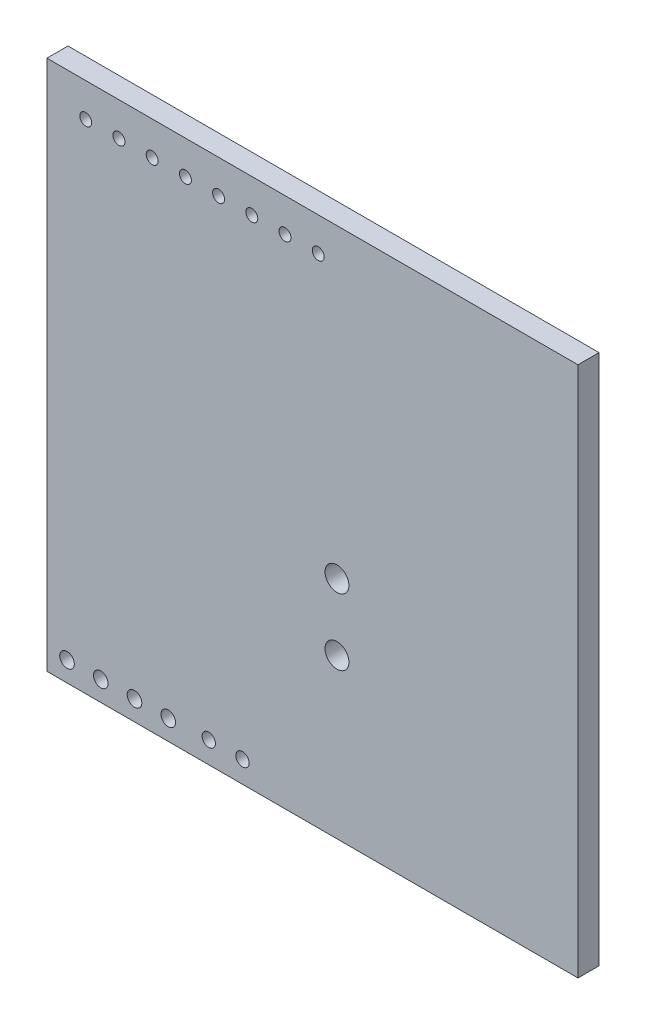
ISO-10303-21;
HEADER;
FILE_DESCRIPTION(('STEP AP214'),'2;1');
FILE_NAME('part.step','',(''),(''),'','','');
FILE_SCHEMA(('AUTOMOTIVE_DESIGN { 1 0 10303 214 1 1 1 1 }'));
ENDSEC;
DATA;
#1=APPLICATION_CONTEXT('core data for automotive mechanical design processes');
#2=APPLICATION_PROTOCOL_DEFINITION('international standard','automotive_design',2000,#1);
#3=PRODUCT_CONTEXT('',#1,'mechanical');
#4=PRODUCT('Part','Part','',(#3));
#5=PRODUCT_RELATED_PRODUCT_CATEGORY('part','',(#4));
#6=PRODUCT_DEFINITION_FORMATION('','',#4);
#7=PRODUCT_DEFINITION_CONTEXT('part definition',#1,'design');
#8=PRODUCT_DEFINITION('design','',#6,#7);
#9=PRODUCT_DEFINITION_SHAPE('','',#8);
#10=(LENGTH_UNIT() NAMED_UNIT(*) SI_UNIT(.MILLI.,.METRE.));
#11=(NAMED_UNIT(*) PLANE_ANGLE_UNIT() SI_UNIT($,.RADIAN.));
#12=(NAMED_UNIT(*) SI_UNIT($,.STERADIAN.) SOLID_ANGLE_UNIT());
#13=UNCERTAINTY_MEASURE_WITH_UNIT(LENGTH_MEASURE(1.E-05),#10,'distance_accuracy_value','');
#14=(GEOMETRIC_REPRESENTATION_CONTEXT(3) GLOBAL_UNCERTAINTY_ASSIGNED_CONTEXT((#13)) GLOBAL_UNIT_ASSIGNED_CONTEXT((#10,
#11,#12)) REPRESENTATION_CONTEXT('',''));
#15=CARTESIAN_POINT('',(0.,0.,0.));
#16=DIRECTION('',(0.,0.,1.));
#17=DIRECTION('',(1.,0.,0.));
#18=AXIS2_PLACEMENT_3D('',#15,#16,#17);
#19=CARTESIAN_POINT('',(20.000039370079,-20.00003937007,1.586156972314));
#20=DIRECTION('',(0.,0.,-1.));
#21=DIRECTION('',(-1.,0.,0.));
#22=AXIS2_PLACEMENT_3D('',#19,#20,#21);
#23=PLANE('',#22);
#24=CARTESIAN_POINT('',(2.93395986792,-2.54000508001,1.586156972314));
#25=DIRECTION('',(0.,0.,1.));
#26=DIRECTION('',(1.,0.,0.));
#27=AXIS2_PLACEMENT_3D('',#24,#25,#26);
#28=CIRCLE('',#27,0.450012700025);
#29=CARTESIAN_POINT('',(3.383972567945,-2.54000508001,1.586156972314));
#30=VERTEX_POINT('',#29);
#31=EDGE_CURVE('E126',#30,#30,#28,.F.);
#32=ORIENTED_EDGE('',*,*,#31,.T.);
#33=EDGE_LOOP('',(#32));
#34=FACE_BOUND('',#33,.T.);
#35=CARTESIAN_POINT('',(5.43395986792,-2.54000508001,1.586156972314));
#36=DIRECTION('',(0.,0.,1.));
#37=DIRECTION('',(1.,0.,0.));
#38=AXIS2_PLACEMENT_3D('',#35,#36,#37);
#39=CIRCLE('',#38,0.450012700025);
#40=CARTESIAN_POINT('',(5.883972567945,-2.54000508001,1.586156972314));
#41=VERTEX_POINT('',#40);
#42=EDGE_CURVE('E130',#41,#41,#39,.F.);
#43=ORIENTED_EDGE('',*,*,#42,.T.);
#44=EDGE_LOOP('',(#43));
#45=FACE_BOUND('',#44,.T.);
#46=CARTESIAN_POINT('',(7.93395986792,-2.54000508001,1.586156972314));
#47=DIRECTION('',(0.,0.,1.));
#48=DIRECTION('',(1.,0.,0.));
#49=AXIS2_PLACEMENT_3D('',#46,#47,#48);
#50=CIRCLE('',#49,0.450012700025);
#51=CARTESIAN_POINT('',(8.383972567945,-2.54000508001,1.586156972314));
#52=VERTEX_POINT('',#51);
#53=EDGE_CURVE('E133',#52,#52,#50,.F.);
#54=ORIENTED_EDGE('',*,*,#53,.T.);
#55=EDGE_LOOP('',(#54));
#56=FACE_BOUND('',#55,.T.);
#57=CARTESIAN_POINT('',(10.43395986792,-2.54000508001,1.586156972314));
#58=DIRECTION('',(0.,0.,1.));
#59=DIRECTION('',(1.,0.,0.));
#60=AXIS2_PLACEMENT_3D('',#57,#58,#59);
#61=CIRCLE('',#60,0.450012700025);
#62=CARTESIAN_POINT('',(10.883972567945,-2.54000508001,1.586156972314));
#63=VERTEX_POINT('',#62);
#64=EDGE_CURVE('E136',#63,#63,#61,.F.);
#65=ORIENTED_EDGE('',*,*,#64,.T.);
#66=EDGE_LOOP('',(#65));
#67=FACE_BOUND('',#66,.T.);
#68=CARTESIAN_POINT('',(12.93395986792,-2.54000508001,1.586156972314));
#69=DIRECTION('',(0.,0.,1.));
#70=DIRECTION('',(1.,0.,0.));
#71=AXIS2_PLACEMENT_3D('',#68,#69,#70);
#72=CIRCLE('',#71,0.450012700025);
#73=CARTESIAN_POINT('',(13.383972567945,-2.54000508001,1.586156972314));
#74=VERTEX_POINT('',#73);
#75=EDGE_CURVE('E139',#74,#74,#72,.F.);
#76=ORIENTED_EDGE('',*,*,#75,.T.);
#77=EDGE_LOOP('',(#76));
#78=FACE_BOUND('',#77,.T.);
#79=CARTESIAN_POINT('',(15.43395986792,-2.54000508001,1.586156972314));
#80=DIRECTION('',(0.,0.,1.));
#81=DIRECTION('',(1.,0.,0.));
#82=AXIS2_PLACEMENT_3D('',#79,#80,#81);
#83=CIRCLE('',#82,0.450012700025);
#84=CARTESIAN_POINT('',(15.883972567945,-2.54000508001,1.586156972314));
#85=VERTEX_POINT('',#84);
#86=EDGE_CURVE('E142',#85,#85,#83,.F.);
#87=ORIENTED_EDGE('',*,*,#86,.T.);
#88=EDGE_LOOP('',(#87));
#89=FACE_BOUND('',#88,.T.);
#90=CARTESIAN_POINT('',(17.93395986792,-2.54000508001,1.586156972314));
#91=DIRECTION('',(0.,0.,1.));
#92=DIRECTION('',(1.,0.,0.));
#93=AXIS2_PLACEMENT_3D('',#90,#91,#92);
#94=CIRCLE('',#93,0.450012700025);
#95=CARTESIAN_POINT('',(18.383972567945,-2.54000508001,1.586156972314));
#96=VERTEX_POINT('',#95);
#97=EDGE_CURVE('E145',#96,#96,#94,.F.);
#98=ORIENTED_EDGE('',*,*,#97,.T.);
#99=EDGE_LOOP('',(#98));
#100=FACE_BOUND('',#99,.T.);
#101=CARTESIAN_POINT('',(20.43395986792,-2.54000508001,1.586156972314));
#102=DIRECTION('',(0.,0.,1.));
#103=DIRECTION('',(1.,0.,0.));
#104=AXIS2_PLACEMENT_3D('',#101,#102,#103);
#105=CIRCLE('',#104,0.450012700025);
#106=CARTESIAN_POINT('',(20.883972567945,-2.54000508001,1.586156972314));
#107=VERTEX_POINT('',#106);
#108=EDGE_CURVE('E148',#107,#107,#105,.F.);
#109=ORIENTED_EDGE('',*,*,#108,.T.);
#110=EDGE_LOOP('',(#109));
#111=FACE_BOUND('',#110,.T.);
#112=CARTESIAN_POINT('',(1.524003048006,-38.48107696215,1.586156972314));
#113=DIRECTION('',(0.,0.,1.));
#114=DIRECTION('',(1.,0.,0.));
#115=AXIS2_PLACEMENT_3D('',#112,#113,#114);
#116=CIRCLE('',#115,0.550012700025);
#117=CARTESIAN_POINT('',(2.074015748031,-38.48107696215,1.586156972314));
#118=VERTEX_POINT('',#117);
#119=EDGE_CURVE('E151',#118,#118,#116,.F.);
#120=ORIENTED_EDGE('',*,*,#119,.T.);
#121=EDGE_LOOP('',(#120));
#122=FACE_BOUND('',#121,.T.);
#123=CARTESIAN_POINT('',(4.064008128016,-38.48107696215,1.586156972314));
#124=DIRECTION('',(0.,0.,1.));
#125=DIRECTION('',(1.,0.,0.));
#126=AXIS2_PLACEMENT_3D('',#123,#124,#125);
#127=CIRCLE('',#126,0.550012700025);
#128=CARTESIAN_POINT('',(4.614020828041,-38.48107696215,1.586156972314));
#129=VERTEX_POINT('',#128);
#130=EDGE_CURVE('E154',#129,#129,#127,.F.);
#131=ORIENTED_EDGE('',*,*,#130,.T.);
#132=EDGE_LOOP('',(#131));
#133=FACE_BOUND('',#132,.T.);
#134=CARTESIAN_POINT('',(6.604013208026,-38.48107696215,1.586156972314));
#135=DIRECTION('',(0.,0.,1.));
#136=DIRECTION('',(1.,0.,0.));
#137=AXIS2_PLACEMENT_3D('',#134,#135,#136);
#138=CIRCLE('',#137,0.550012700025);
#139=CARTESIAN_POINT('',(7.154025908051,-38.48107696215,1.586156972314));
#140=VERTEX_POINT('',#139);
#141=EDGE_CURVE('E157',#140,#140,#138,.F.);
#142=ORIENTED_EDGE('',*,*,#141,.T.);
#143=EDGE_LOOP('',(#142));
#144=FACE_BOUND('',#143,.T.);
#145=CARTESIAN_POINT('',(9.144018288037,-38.48107696215,1.586156972314));
#146=DIRECTION('',(0.,0.,1.));
#147=DIRECTION('',(1.,0.,0.));
#148=AXIS2_PLACEMENT_3D('',#145,#146,#147);
#149=CIRCLE('',#148,0.550012700025);
#150=CARTESIAN_POINT('',(9.694030988062,-38.48107696215,1.586156972314));
#151=VERTEX_POINT('',#150);
#152=EDGE_CURVE('E160',#151,#151,#149,.F.);
#153=ORIENTED_EDGE('',*,*,#152,.T.);
#154=EDGE_LOOP('',(#153));
#155=FACE_BOUND('',#154,.T.);
#156=CARTESIAN_POINT('',(21.844043688087,-23.02692405384,1.586156972314));
#157=DIRECTION('',(0.,0.,1.));
#158=DIRECTION('',(1.,0.,0.));
#159=AXIS2_PLACEMENT_3D('',#156,#157,#158);
#160=CIRCLE('',#159,0.9);
#161=CARTESIAN_POINT('',(22.744043688087,-23.02692405384,1.586156972314));
#162=VERTEX_POINT('',#161);
#163=EDGE_CURVE('E163',#162,#162,#160,.F.);
#164=ORIENTED_EDGE('',*,*,#163,.T.);
#165=EDGE_LOOP('',(#164));
#166=FACE_BOUND('',#165,.T.);
#167=CARTESIAN_POINT('',(21.844043688087,-28.02692405384,1.586156972314));
#168=DIRECTION('',(0.,0.,1.));
#169=DIRECTION('',(1.,0.,0.));
#170=AXIS2_PLACEMENT_3D('',#167,#168,#169);
#171=CIRCLE('',#170,0.9);
#172=CARTESIAN_POINT('',(22.744043688087,-28.02692405384,1.586156972314));
#173=VERTEX_POINT('',#172);
#174=EDGE_CURVE('E166',#173,#173,#171,.F.);
#175=ORIENTED_EDGE('',*,*,#174,.T.);
#176=EDGE_LOOP('',(#175));
#177=FACE_BOUND('',#176,.T.);
#178=CARTESIAN_POINT('',(12.192024384049,-38.35407670815,1.586156972314));
#179=DIRECTION('',(0.,0.,1.));
#180=DIRECTION('',(1.,0.,0.));
#181=AXIS2_PLACEMENT_3D('',#178,#179,#180);
#182=CIRCLE('',#181,0.5);
#183=CARTESIAN_POINT('',(12.692024384049,-38.35407670815,1.586156972314));
#184=VERTEX_POINT('',#183);
#185=EDGE_CURVE('E168',#184,#184,#182,.F.);
#186=ORIENTED_EDGE('',*,*,#185,.T.);
#187=EDGE_LOOP('',(#186));
#188=FACE_BOUND('',#187,.T.);
#189=CARTESIAN_POINT('',(14.732029464059,-38.35407670815,1.586156972314));
#190=DIRECTION('',(0.,0.,1.));
#191=DIRECTION('',(1.,0.,0.));
#192=AXIS2_PLACEMENT_3D('',#189,#190,#191);
#193=CIRCLE('',#192,0.5);
#194=CARTESIAN_POINT('',(15.232029464059,-38.35407670815,1.586156972314));
#195=VERTEX_POINT('',#194);
#196=EDGE_CURVE('E20',#195,#195,#193,.F.);
#197=ORIENTED_EDGE('',*,*,#196,.T.);
#198=EDGE_LOOP('',(#197));
#199=FACE_BOUND('',#198,.T.);
#200=DIRECTION('',(0.,-1.,0.));
#201=VECTOR('',#200,1.);
#202=CARTESIAN_POINT('',(0.01270002540005,-39.98737871475,1.586156972314));
#203=LINE('',#202,#201);
#204=CARTESIAN_POINT('',(0.012700025400049,-39.98737871475,1.586156972314));
#205=VERTEX_POINT('',#204);
#206=CARTESIAN_POINT('',(0.012700025400049,-0.012700025400049,1.586156972314));
#207=VERTEX_POINT('',#206);
#208=EDGE_CURVE('E70',#205,#207,#203,.F.);
#209=ORIENTED_EDGE('',*,*,#208,.F.);
#210=DIRECTION('',(1.,0.,0.));
#211=VECTOR('',#210,1.);
#212=CARTESIAN_POINT('',(39.987378714757,-39.98737871475,1.586156972314));
#213=LINE('',#212,#211);
#214=CARTESIAN_POINT('',(39.987378714757,-39.98737871475,1.586156972314));
#215=VERTEX_POINT('',#214);
#216=EDGE_CURVE('E55',#215,#205,#213,.F.);
#217=ORIENTED_EDGE('',*,*,#216,.F.);
#218=DIRECTION('',(0.,1.,0.));
#219=VECTOR('',#218,1.);
#220=CARTESIAN_POINT('',(39.987378714757,-0.01270002540005,1.586156972314));
#221=LINE('',#220,#219);
#222=CARTESIAN_POINT('',(39.987378714757,-0.0127000254000505,1.586156972314));
#223=VERTEX_POINT('',#222);
#224=EDGE_CURVE('E60',#223,#215,#221,.F.);
#225=ORIENTED_EDGE('',*,*,#224,.F.);
#226=DIRECTION('',(1.,0.,0.));
#227=VECTOR('',#226,1.);
#228=CARTESIAN_POINT('',(0.01270002540005,-0.01270002540005,1.586156972314));
#229=LINE('',#228,#227);
#230=EDGE_CURVE('E175',#207,#223,#229,.T.);
#231=ORIENTED_EDGE('',*,*,#230,.F.);
#232=EDGE_LOOP('',(#209,#217,#225,#231));
#233=FACE_BOUND('',#232,.T.);
#234=ADVANCED_FACE('F17',(#34,#45,#56,#67,#78,#89,#100,#111,#122,#133,#144,#155,#166,#177,#188,
#199,#233),#23,.F.);
#235=CARTESIAN_POINT('',(39.987378714757,-0.01270002540005,0.));
#236=DIRECTION('',(1.,0.,0.));
#237=DIRECTION('',(0.,0.,-1.));
#238=AXIS2_PLACEMENT_3D('',#235,#236,#237);
#239=PLANE('',#238);
#240=DIRECTION('',(0.,0.,-1.));
#241=VECTOR('',#240,1.);
#242=CARTESIAN_POINT('',(39.987378714757,-39.98737871475,0.));
#243=LINE('',#242,#241);
#244=CARTESIAN_POINT('',(39.987378714757,-39.98737871475,0.));
#245=VERTEX_POINT('',#244);
#246=EDGE_CURVE('E62',#245,#215,#243,.F.);
#247=ORIENTED_EDGE('',*,*,#246,.F.);
#248=DIRECTION('',(0.,1.,0.));
#249=VECTOR('',#248,1.);
#250=CARTESIAN_POINT('',(39.987378714757,-20.00003937007,0.));
#251=LINE('',#250,#249);
#252=CARTESIAN_POINT('',(39.987378714757,-0.0127000254000503,0.));
#253=VERTEX_POINT('',#252);
#254=EDGE_CURVE('E129',#253,#245,#251,.F.);
#255=ORIENTED_EDGE('',*,*,#254,.F.);
#256=DIRECTION('',(0.,0.,1.));
#257=VECTOR('',#256,1.);
#258=CARTESIAN_POINT('',(39.987378714757,-0.01270002540005,0.));
#259=LINE('',#258,#257);
#260=EDGE_CURVE('E65',#223,#253,#259,.F.);
#261=ORIENTED_EDGE('',*,*,#260,.F.);
#262=ORIENTED_EDGE('',*,*,#224,.T.);
#263=EDGE_LOOP('',(#247,#255,#261,#262));
#264=FACE_BOUND('',#263,.T.);
#265=ADVANCED_FACE('F61',(#264),#239,.T.);
#266=CARTESIAN_POINT('',(39.987378714757,-39.98737871475,0.));
#267=DIRECTION('',(0.,-1.,0.));
#268=DIRECTION('',(0.,0.,-1.));
#269=AXIS2_PLACEMENT_3D('',#266,#267,#268);
#270=PLANE('',#269);
#271=DIRECTION('',(0.,0.,1.));
#272=VECTOR('',#271,1.);
#273=CARTESIAN_POINT('',(0.01270002540005,-39.98737871475,0.));
#274=LINE('',#273,#272);
#275=CARTESIAN_POINT('',(0.012700025400049,-39.98737871475,0.));
#276=VERTEX_POINT('',#275);
#277=EDGE_CURVE('E72',#276,#205,#274,.T.);
#278=ORIENTED_EDGE('',*,*,#277,.F.);
#279=DIRECTION('',(-1.,0.,0.));
#280=VECTOR('',#279,1.);
#281=CARTESIAN_POINT('',(20.000039370079,-39.98737871475,0.));
#282=LINE('',#281,#280);
#283=EDGE_CURVE('E76',#245,#276,#282,.T.);
#284=ORIENTED_EDGE('',*,*,#283,.F.);
#285=ORIENTED_EDGE('',*,*,#246,.T.);
#286=ORIENTED_EDGE('',*,*,#216,.T.);
#287=EDGE_LOOP('',(#278,#284,#285,#286));
#288=FACE_BOUND('',#287,.T.);
#289=ADVANCED_FACE('F74',(#288),#270,.T.);
#290=CARTESIAN_POINT('',(0.01270002540005,-39.98737871475,0.));
#291=DIRECTION('',(-1.,0.,0.));
#292=DIRECTION('',(0.,-1.,0.));
#293=AXIS2_PLACEMENT_3D('',#290,#291,#292);
#294=PLANE('',#293);
#295=DIRECTION('',(0.,0.,1.));
#296=VECTOR('',#295,1.);
#297=CARTESIAN_POINT('',(0.01270002540005,-0.01270002540005,0.));
#298=LINE('',#297,#296);
#299=CARTESIAN_POINT('',(0.012700025400049,-0.012700025400049,0.));
#300=VERTEX_POINT('',#299);
#301=EDGE_CURVE('E35',#300,#207,#298,.T.);
#302=ORIENTED_EDGE('',*,*,#301,.F.);
#303=DIRECTION('',(0.,1.,0.));
#304=VECTOR('',#303,1.);
#305=CARTESIAN_POINT('',(0.012700025400051,-20.00003937007,0.));
#306=LINE('',#305,#304);
#307=EDGE_CURVE('E186',#276,#300,#306,.T.);
#308=ORIENTED_EDGE('',*,*,#307,.F.);
#309=ORIENTED_EDGE('',*,*,#277,.T.);
#310=ORIENTED_EDGE('',*,*,#208,.T.);
#311=EDGE_LOOP('',(#302,#308,#309,#310));
#312=FACE_BOUND('',#311,.T.);
#313=ADVANCED_FACE('F184',(#312),#294,.T.);
#314=CARTESIAN_POINT('',(0.01270002540005,-0.01270002540005,0.));
#315=DIRECTION('',(0.,1.,0.));
#316=DIRECTION('',(0.,0.,1.));
#317=AXIS2_PLACEMENT_3D('',#314,#315,#316);
#318=PLANE('',#317);
#319=ORIENTED_EDGE('',*,*,#260,.T.);
#320=DIRECTION('',(-1.,0.,0.));
#321=VECTOR('',#320,1.);
#322=CARTESIAN_POINT('',(20.000039370079,-0.012700025400051,0.));
#323=LINE('',#322,#321);
#324=EDGE_CURVE('E125',#300,#253,#323,.F.);
#325=ORIENTED_EDGE('',*,*,#324,.F.);
#326=ORIENTED_EDGE('',*,*,#301,.T.);
#327=ORIENTED_EDGE('',*,*,#230,.T.);
#328=EDGE_LOOP('',(#319,#325,#326,#327));
#329=FACE_BOUND('',#328,.T.);
#330=ADVANCED_FACE('F191',(#329),#318,.T.);
#331=CARTESIAN_POINT('',(14.732029464059,-38.35407670815,0.));
#332=DIRECTION('',(0.,0.,1.));
#333=DIRECTION('',(1.,0.,0.));
#334=AXIS2_PLACEMENT_3D('',#331,#332,#333);
#335=CYLINDRICAL_SURFACE('',#334,0.5);
#336=CARTESIAN_POINT('',(14.732029464059,-38.35407670815,0.));
#337=DIRECTION('',(0.,0.,1.));
#338=DIRECTION('',(1.,0.,0.));
#339=AXIS2_PLACEMENT_3D('',#336,#337,#338);
#340=CIRCLE('',#339,0.5);
#341=CARTESIAN_POINT('',(15.232029464059,-38.35407670815,0.));
#342=VERTEX_POINT('',#341);
#343=EDGE_CURVE('E122',#342,#342,#340,.T.);
#344=ORIENTED_EDGE('',*,*,#343,.F.);
#345=EDGE_LOOP('',(#344));
#346=FACE_BOUND('',#345,.T.);
#347=ORIENTED_EDGE('',*,*,#196,.F.);
#348=EDGE_LOOP('',(#347));
#349=FACE_BOUND('',#348,.T.);
#350=ADVANCED_FACE('F193',(#346,#349),#335,.F.);
#351=CARTESIAN_POINT('',(12.192024384049,-38.35407670815,0.));
#352=DIRECTION('',(0.,0.,1.));
#353=DIRECTION('',(1.,0.,0.));
#354=AXIS2_PLACEMENT_3D('',#351,#352,#353);
#355=CYLINDRICAL_SURFACE('',#354,0.5);
#356=CARTESIAN_POINT('',(12.192024384049,-38.35407670815,0.));
#357=DIRECTION('',(0.,0.,1.));
#358=DIRECTION('',(1.,0.,0.));
#359=AXIS2_PLACEMENT_3D('',#356,#357,#358);
#360=CIRCLE('',#359,0.5);
#361=CARTESIAN_POINT('',(12.692024384049,-38.35407670815,0.));
#362=VERTEX_POINT('',#361);
#363=EDGE_CURVE('E119',#362,#362,#360,.T.);
#364=ORIENTED_EDGE('',*,*,#363,.F.);
#365=EDGE_LOOP('',(#364));
#366=FACE_BOUND('',#365,.T.);
#367=ORIENTED_EDGE('',*,*,#185,.F.);
#368=EDGE_LOOP('',(#367));
#369=FACE_BOUND('',#368,.T.);
#370=ADVANCED_FACE('F200',(#366,#369),#355,.F.);
#371=CARTESIAN_POINT('',(21.844043688087,-28.02692405384,0.));
#372=DIRECTION('',(0.,0.,1.));
#373=DIRECTION('',(1.,0.,0.));
#374=AXIS2_PLACEMENT_3D('',#371,#372,#373);
#375=CYLINDRICAL_SURFACE('',#374,0.9);
#376=CARTESIAN_POINT('',(21.844043688087,-28.02692405384,0.));
#377=DIRECTION('',(0.,0.,1.));
#378=DIRECTION('',(1.,0.,0.));
#379=AXIS2_PLACEMENT_3D('',#376,#377,#378);
#380=CIRCLE('',#379,0.9);
#381=CARTESIAN_POINT('',(22.744043688087,-28.02692405384,0.));
#382=VERTEX_POINT('',#381);
#383=EDGE_CURVE('E116',#382,#382,#380,.T.);
#384=ORIENTED_EDGE('',*,*,#383,.F.);
#385=EDGE_LOOP('',(#384));
#386=FACE_BOUND('',#385,.T.);
#387=ORIENTED_EDGE('',*,*,#174,.F.);
#388=EDGE_LOOP('',(#387));
#389=FACE_BOUND('',#388,.T.);
#390=ADVANCED_FACE('F262',(#386,#389),#375,.F.);
#391=CARTESIAN_POINT('',(21.844043688087,-23.02692405384,0.));
#392=DIRECTION('',(0.,0.,1.));
#393=DIRECTION('',(1.,0.,0.));
#394=AXIS2_PLACEMENT_3D('',#391,#392,#393);
#395=CYLINDRICAL_SURFACE('',#394,0.9);
#396=CARTESIAN_POINT('',(21.844043688087,-23.02692405384,0.));
#397=DIRECTION('',(0.,0.,1.));
#398=DIRECTION('',(1.,0.,0.));
#399=AXIS2_PLACEMENT_3D('',#396,#397,#398);
#400=CIRCLE('',#399,0.9);
#401=CARTESIAN_POINT('',(22.744043688087,-23.02692405384,0.));
#402=VERTEX_POINT('',#401);
#403=EDGE_CURVE('E113',#402,#402,#400,.T.);
#404=ORIENTED_EDGE('',*,*,#403,.F.);
#405=EDGE_LOOP('',(#404));
#406=FACE_BOUND('',#405,.T.);
#407=ORIENTED_EDGE('',*,*,#163,.F.);
#408=EDGE_LOOP('',(#407));
#409=FACE_BOUND('',#408,.T.);
#410=ADVANCED_FACE('F258',(#406,#409),#395,.F.);
#411=CARTESIAN_POINT('',(9.144018288037,-38.48107696215,0.));
#412=DIRECTION('',(0.,0.,1.));
#413=DIRECTION('',(1.,0.,0.));
#414=AXIS2_PLACEMENT_3D('',#411,#412,#413);
#415=CYLINDRICAL_SURFACE('',#414,0.550012700025);
#416=CARTESIAN_POINT('',(9.144018288037,-38.48107696215,0.));
#417=DIRECTION('',(0.,0.,1.));
#418=DIRECTION('',(1.,0.,0.));
#419=AXIS2_PLACEMENT_3D('',#416,#417,#418);
#420=CIRCLE('',#419,0.550012700025);
#421=CARTESIAN_POINT('',(9.694030988062,-38.48107696215,0.));
#422=VERTEX_POINT('',#421);
#423=EDGE_CURVE('E110',#422,#422,#420,.T.);
#424=ORIENTED_EDGE('',*,*,#423,.F.);
#425=EDGE_LOOP('',(#424));
#426=FACE_BOUND('',#425,.T.);
#427=ORIENTED_EDGE('',*,*,#152,.F.);
#428=EDGE_LOOP('',(#427));
#429=FACE_BOUND('',#428,.T.);
#430=ADVANCED_FACE('F254',(#426,#429),#415,.F.);
#431=CARTESIAN_POINT('',(6.604013208026,-38.48107696215,0.));
#432=DIRECTION('',(0.,0.,1.));
#433=DIRECTION('',(1.,0.,0.));
#434=AXIS2_PLACEMENT_3D('',#431,#432,#433);
#435=CYLINDRICAL_SURFACE('',#434,0.550012700025);
#436=CARTESIAN_POINT('',(6.604013208026,-38.48107696215,0.));
#437=DIRECTION('',(0.,0.,1.));
#438=DIRECTION('',(1.,0.,0.));
#439=AXIS2_PLACEMENT_3D('',#436,#437,#438);
#440=CIRCLE('',#439,0.550012700025);
#441=CARTESIAN_POINT('',(7.154025908051,-38.48107696215,0.));
#442=VERTEX_POINT('',#441);
#443=EDGE_CURVE('E107',#442,#442,#440,.T.);
#444=ORIENTED_EDGE('',*,*,#443,.F.);
#445=EDGE_LOOP('',(#444));
#446=FACE_BOUND('',#445,.T.);
#447=ORIENTED_EDGE('',*,*,#141,.F.);
#448=EDGE_LOOP('',(#447));
#449=FACE_BOUND('',#448,.T.);
#450=ADVANCED_FACE('F250',(#446,#449),#435,.F.);
#451=CARTESIAN_POINT('',(4.064008128016,-38.48107696215,0.));
#452=DIRECTION('',(0.,0.,1.));
#453=DIRECTION('',(1.,0.,0.));
#454=AXIS2_PLACEMENT_3D('',#451,#452,#453);
#455=CYLINDRICAL_SURFACE('',#454,0.550012700025);
#456=CARTESIAN_POINT('',(4.064008128016,-38.48107696215,0.));
#457=DIRECTION('',(0.,0.,1.));
#458=DIRECTION('',(1.,0.,0.));
#459=AXIS2_PLACEMENT_3D('',#456,#457,#458);
#460=CIRCLE('',#459,0.550012700025);
#461=CARTESIAN_POINT('',(4.614020828041,-38.48107696215,0.));
#462=VERTEX_POINT('',#461);
#463=EDGE_CURVE('E104',#462,#462,#460,.T.);
#464=ORIENTED_EDGE('',*,*,#463,.F.);
#465=EDGE_LOOP('',(#464));
#466=FACE_BOUND('',#465,.T.);
#467=ORIENTED_EDGE('',*,*,#130,.F.);
#468=EDGE_LOOP('',(#467));
#469=FACE_BOUND('',#468,.T.);
#470=ADVANCED_FACE('F246',(#466,#469),#455,.F.);
#471=CARTESIAN_POINT('',(1.524003048006,-38.48107696215,0.));
#472=DIRECTION('',(0.,0.,1.));
#473=DIRECTION('',(1.,0.,0.));
#474=AXIS2_PLACEMENT_3D('',#471,#472,#473);
#475=CYLINDRICAL_SURFACE('',#474,0.550012700025);
#476=CARTESIAN_POINT('',(1.524003048006,-38.48107696215,0.));
#477=DIRECTION('',(0.,0.,1.));
#478=DIRECTION('',(1.,0.,0.));
#479=AXIS2_PLACEMENT_3D('',#476,#477,#478);
#480=CIRCLE('',#479,0.550012700025);
#481=CARTESIAN_POINT('',(2.074015748031,-38.48107696215,0.));
#482=VERTEX_POINT('',#481);
#483=EDGE_CURVE('E101',#482,#482,#480,.T.);
#484=ORIENTED_EDGE('',*,*,#483,.F.);
#485=EDGE_LOOP('',(#484));
#486=FACE_BOUND('',#485,.T.);
#487=ORIENTED_EDGE('',*,*,#119,.F.);
#488=EDGE_LOOP('',(#487));
#489=FACE_BOUND('',#488,.T.);
#490=ADVANCED_FACE('F242',(#486,#489),#475,.F.);
#491=CARTESIAN_POINT('',(20.43395986792,-2.54000508001,0.));
#492=DIRECTION('',(0.,0.,1.));
#493=DIRECTION('',(1.,0.,0.));
#494=AXIS2_PLACEMENT_3D('',#491,#492,#493);
#495=CYLINDRICAL_SURFACE('',#494,0.450012700025);
#496=CARTESIAN_POINT('',(20.43395986792,-2.54000508001,0.));
#497=DIRECTION('',(0.,0.,1.));
#498=DIRECTION('',(1.,0.,0.));
#499=AXIS2_PLACEMENT_3D('',#496,#497,#498);
#500=CIRCLE('',#499,0.450012700025);
#501=CARTESIAN_POINT('',(20.883972567945,-2.54000508001,0.));
#502=VERTEX_POINT('',#501);
#503=EDGE_CURVE('E98',#502,#502,#500,.T.);
#504=ORIENTED_EDGE('',*,*,#503,.F.);
#505=EDGE_LOOP('',(#504));
#506=FACE_BOUND('',#505,.T.);
#507=ORIENTED_EDGE('',*,*,#108,.F.);
#508=EDGE_LOOP('',(#507));
#509=FACE_BOUND('',#508,.T.);
#510=ADVANCED_FACE('F238',(#506,#509),#495,.F.);
#511=CARTESIAN_POINT('',(17.93395986792,-2.54000508001,0.));
#512=DIRECTION('',(0.,0.,1.));
#513=DIRECTION('',(1.,0.,0.));
#514=AXIS2_PLACEMENT_3D('',#511,#512,#513);
#515=CYLINDRICAL_SURFACE('',#514,0.450012700025);
#516=CARTESIAN_POINT('',(17.93395986792,-2.54000508001,0.));
#517=DIRECTION('',(0.,0.,1.));
#518=DIRECTION('',(1.,0.,0.));
#519=AXIS2_PLACEMENT_3D('',#516,#517,#518);
#520=CIRCLE('',#519,0.450012700025);
#521=CARTESIAN_POINT('',(18.383972567945,-2.54000508001,0.));
#522=VERTEX_POINT('',#521);
#523=EDGE_CURVE('E95',#522,#522,#520,.T.);
#524=ORIENTED_EDGE('',*,*,#523,.F.);
#525=EDGE_LOOP('',(#524));
#526=FACE_BOUND('',#525,.T.);
#527=ORIENTED_EDGE('',*,*,#97,.F.);
#528=EDGE_LOOP('',(#527));
#529=FACE_BOUND('',#528,.T.);
#530=ADVANCED_FACE('F234',(#526,#529),#515,.F.);
#531=CARTESIAN_POINT('',(15.43395986792,-2.54000508001,0.));
#532=DIRECTION('',(0.,0.,1.));
#533=DIRECTION('',(1.,0.,0.));
#534=AXIS2_PLACEMENT_3D('',#531,#532,#533);
#535=CYLINDRICAL_SURFACE('',#534,0.450012700025);
#536=CARTESIAN_POINT('',(15.43395986792,-2.54000508001,0.));
#537=DIRECTION('',(0.,0.,1.));
#538=DIRECTION('',(1.,0.,0.));
#539=AXIS2_PLACEMENT_3D('',#536,#537,#538);
#540=CIRCLE('',#539,0.450012700025);
#541=CARTESIAN_POINT('',(15.883972567945,-2.54000508001,0.));
#542=VERTEX_POINT('',#541);
#543=EDGE_CURVE('E92',#542,#542,#540,.T.);
#544=ORIENTED_EDGE('',*,*,#543,.F.);
#545=EDGE_LOOP('',(#544));
#546=FACE_BOUND('',#545,.T.);
#547=ORIENTED_EDGE('',*,*,#86,.F.);
#548=EDGE_LOOP('',(#547));
#549=FACE_BOUND('',#548,.T.);
#550=ADVANCED_FACE('F230',(#546,#549),#535,.F.);
#551=CARTESIAN_POINT('',(12.93395986792,-2.54000508001,0.));
#552=DIRECTION('',(0.,0.,1.));
#553=DIRECTION('',(1.,0.,0.));
#554=AXIS2_PLACEMENT_3D('',#551,#552,#553);
#555=CYLINDRICAL_SURFACE('',#554,0.450012700025);
#556=CARTESIAN_POINT('',(12.93395986792,-2.54000508001,0.));
#557=DIRECTION('',(0.,0.,1.));
#558=DIRECTION('',(1.,0.,0.));
#559=AXIS2_PLACEMENT_3D('',#556,#557,#558);
#560=CIRCLE('',#559,0.450012700025);
#561=CARTESIAN_POINT('',(13.383972567945,-2.54000508001,0.));
#562=VERTEX_POINT('',#561);
#563=EDGE_CURVE('E89',#562,#562,#560,.T.);
#564=ORIENTED_EDGE('',*,*,#563,.F.);
#565=EDGE_LOOP('',(#564));
#566=FACE_BOUND('',#565,.T.);
#567=ORIENTED_EDGE('',*,*,#75,.F.);
#568=EDGE_LOOP('',(#567));
#569=FACE_BOUND('',#568,.T.);
#570=ADVANCED_FACE('F226',(#566,#569),#555,.F.);
#571=CARTESIAN_POINT('',(10.43395986792,-2.54000508001,0.));
#572=DIRECTION('',(0.,0.,1.));
#573=DIRECTION('',(1.,0.,0.));
#574=AXIS2_PLACEMENT_3D('',#571,#572,#573);
#575=CYLINDRICAL_SURFACE('',#574,0.450012700025);
#576=CARTESIAN_POINT('',(10.43395986792,-2.54000508001,0.));
#577=DIRECTION('',(0.,0.,1.));
#578=DIRECTION('',(1.,0.,0.));
#579=AXIS2_PLACEMENT_3D('',#576,#577,#578);
#580=CIRCLE('',#579,0.450012700025);
#581=CARTESIAN_POINT('',(10.883972567945,-2.54000508001,0.));
#582=VERTEX_POINT('',#581);
#583=EDGE_CURVE('E86',#582,#582,#580,.T.);
#584=ORIENTED_EDGE('',*,*,#583,.F.);
#585=EDGE_LOOP('',(#584));
#586=FACE_BOUND('',#585,.T.);
#587=ORIENTED_EDGE('',*,*,#64,.F.);
#588=EDGE_LOOP('',(#587));
#589=FACE_BOUND('',#588,.T.);
#590=ADVANCED_FACE('F222',(#586,#589),#575,.F.);
#591=CARTESIAN_POINT('',(7.93395986792,-2.54000508001,0.));
#592=DIRECTION('',(0.,0.,1.));
#593=DIRECTION('',(1.,0.,0.));
#594=AXIS2_PLACEMENT_3D('',#591,#592,#593);
#595=CYLINDRICAL_SURFACE('',#594,0.450012700025);
#596=CARTESIAN_POINT('',(7.93395986792,-2.54000508001,0.));
#597=DIRECTION('',(0.,0.,1.));
#598=DIRECTION('',(1.,0.,0.));
#599=AXIS2_PLACEMENT_3D('',#596,#597,#598);
#600=CIRCLE('',#599,0.450012700025);
#601=CARTESIAN_POINT('',(8.383972567945,-2.54000508001,0.));
#602=VERTEX_POINT('',#601);
#603=EDGE_CURVE('E83',#602,#602,#600,.T.);
#604=ORIENTED_EDGE('',*,*,#603,.F.);
#605=EDGE_LOOP('',(#604));
#606=FACE_BOUND('',#605,.T.);
#607=ORIENTED_EDGE('',*,*,#53,.F.);
#608=EDGE_LOOP('',(#607));
#609=FACE_BOUND('',#608,.T.);
#610=ADVANCED_FACE('F218',(#606,#609),#595,.F.);
#611=CARTESIAN_POINT('',(5.43395986792,-2.54000508001,0.));
#612=DIRECTION('',(0.,0.,1.));
#613=DIRECTION('',(1.,0.,0.));
#614=AXIS2_PLACEMENT_3D('',#611,#612,#613);
#615=CYLINDRICAL_SURFACE('',#614,0.450012700025);
#616=CARTESIAN_POINT('',(5.43395986792,-2.54000508001,0.));
#617=DIRECTION('',(0.,0.,1.));
#618=DIRECTION('',(1.,0.,0.));
#619=AXIS2_PLACEMENT_3D('',#616,#617,#618);
#620=CIRCLE('',#619,0.450012700025);
#621=CARTESIAN_POINT('',(5.883972567945,-2.54000508001,0.));
#622=VERTEX_POINT('',#621);
#623=EDGE_CURVE('E26',#622,#622,#620,.T.);
#624=ORIENTED_EDGE('',*,*,#623,.F.);
#625=EDGE_LOOP('',(#624));
#626=FACE_BOUND('',#625,.T.);
#627=ORIENTED_EDGE('',*,*,#42,.F.);
#628=EDGE_LOOP('',(#627));
#629=FACE_BOUND('',#628,.T.);
#630=ADVANCED_FACE('F211',(#626,#629),#615,.F.);
#631=CARTESIAN_POINT('',(2.93395986792,-2.54000508001,0.));
#632=DIRECTION('',(0.,0.,1.));
#633=DIRECTION('',(1.,0.,0.));
#634=AXIS2_PLACEMENT_3D('',#631,#632,#633);
#635=CYLINDRICAL_SURFACE('',#634,0.450012700025);
#636=CARTESIAN_POINT('',(2.93395986792,-2.54000508001,0.));
#637=DIRECTION('',(0.,0.,1.));
#638=DIRECTION('',(1.,0.,0.));
#639=AXIS2_PLACEMENT_3D('',#636,#637,#638);
#640=CIRCLE('',#639,0.450012700025);
#641=CARTESIAN_POINT('',(3.383972567945,-2.54000508001,0.));
#642=VERTEX_POINT('',#641);
#643=EDGE_CURVE('E11',#642,#642,#640,.T.);
#644=ORIENTED_EDGE('',*,*,#643,.F.);
#645=EDGE_LOOP('',(#644));
#646=FACE_BOUND('',#645,.T.);
#647=ORIENTED_EDGE('',*,*,#31,.F.);
#648=EDGE_LOOP('',(#647));
#649=FACE_BOUND('',#648,.T.);
#650=ADVANCED_FACE('F205',(#646,#649),#635,.F.);
#651=CARTESIAN_POINT('',(20.000039370079,-20.00003937007,0.));
#652=DIRECTION('',(0.,0.,-1.));
#653=DIRECTION('',(-1.,0.,0.));
#654=AXIS2_PLACEMENT_3D('',#651,#652,#653);
#655=PLANE('',#654);
#656=ORIENTED_EDGE('',*,*,#643,.T.);
#657=EDGE_LOOP('',(#656));
#658=FACE_BOUND('',#657,.T.);
#659=ORIENTED_EDGE('',*,*,#623,.T.);
#660=EDGE_LOOP('',(#659));
#661=FACE_BOUND('',#660,.T.);
#662=ORIENTED_EDGE('',*,*,#603,.T.);
#663=EDGE_LOOP('',(#662));
#664=FACE_BOUND('',#663,.T.);
#665=ORIENTED_EDGE('',*,*,#583,.T.);
#666=EDGE_LOOP('',(#665));
#667=FACE_BOUND('',#666,.T.);
#668=ORIENTED_EDGE('',*,*,#563,.T.);
#669=EDGE_LOOP('',(#668));
#670=FACE_BOUND('',#669,.T.);
#671=ORIENTED_EDGE('',*,*,#543,.T.);
#672=EDGE_LOOP('',(#671));
#673=FACE_BOUND('',#672,.T.);
#674=ORIENTED_EDGE('',*,*,#523,.T.);
#675=EDGE_LOOP('',(#674));
#676=FACE_BOUND('',#675,.T.);
#677=ORIENTED_EDGE('',*,*,#503,.T.);
#678=EDGE_LOOP('',(#677));
#679=FACE_BOUND('',#678,.T.);
#680=ORIENTED_EDGE('',*,*,#483,.T.);
#681=EDGE_LOOP('',(#680));
#682=FACE_BOUND('',#681,.T.);
#683=ORIENTED_EDGE('',*,*,#463,.T.);
#684=EDGE_LOOP('',(#683));
#685=FACE_BOUND('',#684,.T.);
#686=ORIENTED_EDGE('',*,*,#443,.T.);
#687=EDGE_LOOP('',(#686));
#688=FACE_BOUND('',#687,.T.);
#689=ORIENTED_EDGE('',*,*,#423,.T.);
#690=EDGE_LOOP('',(#689));
#691=FACE_BOUND('',#690,.T.);
#692=ORIENTED_EDGE('',*,*,#403,.T.);
#693=EDGE_LOOP('',(#692));
#694=FACE_BOUND('',#693,.T.);
#695=ORIENTED_EDGE('',*,*,#383,.T.);
#696=EDGE_LOOP('',(#695));
#697=FACE_BOUND('',#696,.T.);
#698=ORIENTED_EDGE('',*,*,#363,.T.);
#699=EDGE_LOOP('',(#698));
#700=FACE_BOUND('',#699,.T.);
#701=ORIENTED_EDGE('',*,*,#343,.T.);
#702=EDGE_LOOP('',(#701));
#703=FACE_BOUND('',#702,.T.);
#704=ORIENTED_EDGE('',*,*,#307,.T.);
#705=ORIENTED_EDGE('',*,*,#324,.T.);
#706=ORIENTED_EDGE('',*,*,#254,.T.);
#707=ORIENTED_EDGE('',*,*,#283,.T.);
#708=EDGE_LOOP('',(#704,#705,#706,#707));
#709=FACE_BOUND('',#708,.T.);
#710=ADVANCED_FACE('F189',(#658,#661,#664,#667,#670,#673,#676,#679,#682,#685,#688,#691,#694,
#697,#700,#703,#709),#655,.T.);
#711=CLOSED_SHELL('',(#234,#265,#289,#313,#330,#350,#370,#390,#410,#430,#450,#470,#490,#510,
#530,#550,#570,#590,#610,#630,#650,#710));
#712=MANIFOLD_SOLID_BREP('B1',#711);
#713=ADVANCED_BREP_SHAPE_REPRESENTATION('',(#18,#712),#14);
#714=SHAPE_DEFINITION_REPRESENTATION(#9,#713);
ENDSEC;
END-ISO-10303-21;
